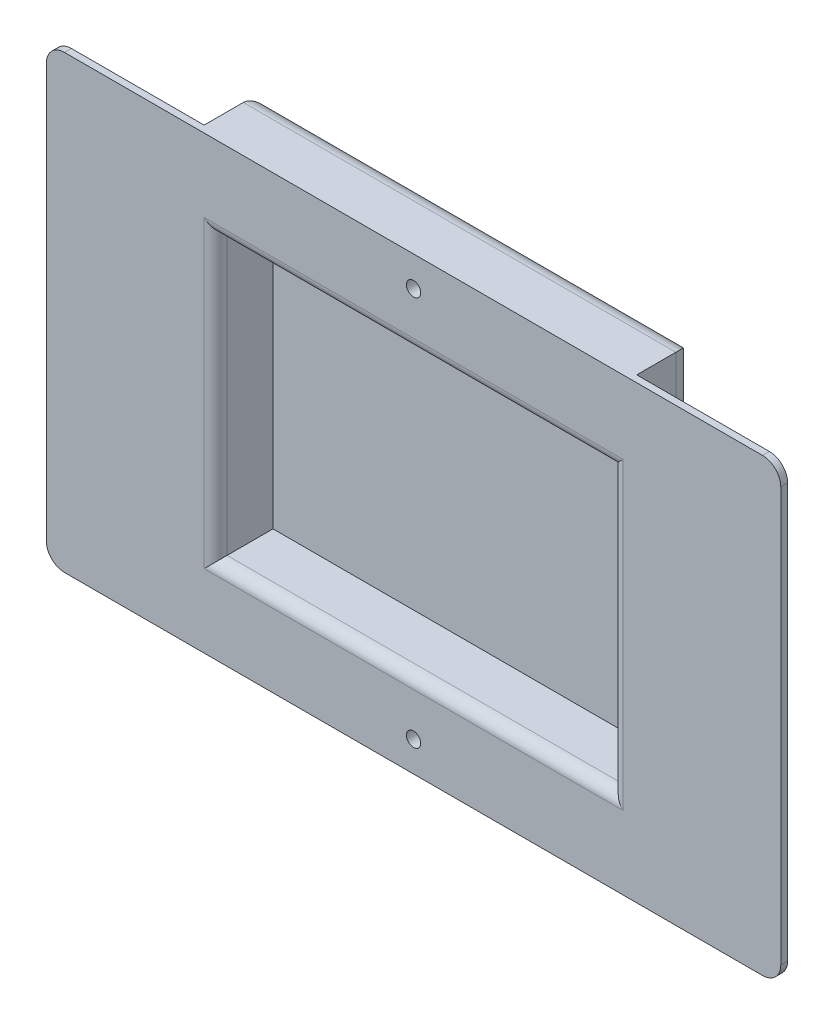
ISO-10303-21;
HEADER;
FILE_DESCRIPTION(('STEP AP214'),'2;1');
FILE_NAME('part.step','',(''),(''),'','','');
FILE_SCHEMA(('AUTOMOTIVE_DESIGN { 1 0 10303 214 1 1 1 1 }'));
ENDSEC;
DATA;
#1=APPLICATION_CONTEXT('core data for automotive mechanical design processes');
#2=APPLICATION_PROTOCOL_DEFINITION('international standard','automotive_design',2000,#1);
#3=PRODUCT_CONTEXT('',#1,'mechanical');
#4=PRODUCT('Part','Part','',(#3));
#5=PRODUCT_RELATED_PRODUCT_CATEGORY('part','',(#4));
#6=PRODUCT_DEFINITION_FORMATION('','',#4);
#7=PRODUCT_DEFINITION_CONTEXT('part definition',#1,'design');
#8=PRODUCT_DEFINITION('design','',#6,#7);
#9=PRODUCT_DEFINITION_SHAPE('','',#8);
#10=(LENGTH_UNIT() NAMED_UNIT(*) SI_UNIT(.MILLI.,.METRE.));
#11=(NAMED_UNIT(*) PLANE_ANGLE_UNIT() SI_UNIT($,.RADIAN.));
#12=(NAMED_UNIT(*) SI_UNIT($,.STERADIAN.) SOLID_ANGLE_UNIT());
#13=UNCERTAINTY_MEASURE_WITH_UNIT(LENGTH_MEASURE(1.E-05),#10,'distance_accuracy_value','');
#14=(GEOMETRIC_REPRESENTATION_CONTEXT(3) GLOBAL_UNCERTAINTY_ASSIGNED_CONTEXT((#13)) GLOBAL_UNIT_ASSIGNED_CONTEXT((#10,
#11,#12)) REPRESENTATION_CONTEXT('',''));
#15=CARTESIAN_POINT('',(0.,0.,0.));
#16=DIRECTION('',(0.,0.,1.));
#17=DIRECTION('',(1.,0.,0.));
#18=AXIS2_PLACEMENT_3D('',#15,#16,#17);
#19=CARTESIAN_POINT('',(64.,-39.25,11.2));
#20=DIRECTION('',(-1.,0.,0.));
#21=DIRECTION('',(0.,0.,1.));
#22=AXIS2_PLACEMENT_3D('',#19,#20,#21);
#23=PLANE('',#22);
#24=DIRECTION('',(0.,-1.,0.));
#25=VECTOR('',#24,1.);
#26=CARTESIAN_POINT('',(64.,39.251,10.));
#27=LINE('',#26,#25);
#28=CARTESIAN_POINT('',(64.,36.075,10.));
#29=VERTEX_POINT('',#28);
#30=CARTESIAN_POINT('',(64.,-36.075,10.));
#31=VERTEX_POINT('',#30);
#32=EDGE_CURVE('E187',#29,#31,#27,.T.);
#33=ORIENTED_EDGE('',*,*,#32,.F.);
#34=DIRECTION('',(0.,0.,-1.));
#35=VECTOR('',#34,1.);
#36=CARTESIAN_POINT('',(64.,36.075,11.2));
#37=LINE('',#36,#35);
#38=CARTESIAN_POINT('',(64.,36.075,11.2));
#39=VERTEX_POINT('',#38);
#40=EDGE_CURVE('E11',#29,#39,#37,.F.);
#41=ORIENTED_EDGE('',*,*,#40,.T.);
#42=DIRECTION('',(0.,1.,0.));
#43=VECTOR('',#42,1.);
#44=CARTESIAN_POINT('',(64.,-39.25,11.2));
#45=LINE('',#44,#43);
#46=CARTESIAN_POINT('',(64.,-36.075,11.2));
#47=VERTEX_POINT('',#46);
#48=EDGE_CURVE('E272',#47,#39,#45,.T.);
#49=ORIENTED_EDGE('',*,*,#48,.F.);
#50=DIRECTION('',(0.,0.,-1.));
#51=VECTOR('',#50,1.);
#52=CARTESIAN_POINT('',(64.,-36.075,11.2));
#53=LINE('',#52,#51);
#54=EDGE_CURVE('E49',#47,#31,#53,.T.);
#55=ORIENTED_EDGE('',*,*,#54,.T.);
#56=EDGE_LOOP('',(#33,#41,#49,#55));
#57=FACE_BOUND('',#56,.T.);
#58=ADVANCED_FACE('F39',(#57),#23,.F.);
#59=CARTESIAN_POINT('',(-64.,39.25,11.2));
#60=DIRECTION('',(0.,-1.,0.));
#61=DIRECTION('',(0.,0.,-1.));
#62=AXIS2_PLACEMENT_3D('',#59,#60,#61);
#63=PLANE('',#62);
#64=DIRECTION('',(0.,0.,1.));
#65=VECTOR('',#64,1.);
#66=CARTESIAN_POINT('',(37.7,39.25,10.));
#67=LINE('',#66,#65);
#68=CARTESIAN_POINT('',(37.7,39.25,3.175));
#69=VERTEX_POINT('',#68);
#70=CARTESIAN_POINT('',(37.7,39.25,10.));
#71=VERTEX_POINT('',#70);
#72=EDGE_CURVE('E195',#69,#71,#67,.T.);
#73=ORIENTED_EDGE('',*,*,#72,.F.);
#74=DIRECTION('',(-1.,0.,0.));
#75=VECTOR('',#74,1.);
#76=CARTESIAN_POINT('',(-37.6999999999999,39.25,3.175));
#77=LINE('',#76,#75);
#78=CARTESIAN_POINT('',(-37.7,39.25,3.17499999999998));
#79=VERTEX_POINT('',#78);
#80=EDGE_CURVE('E344',#69,#79,#77,.T.);
#81=ORIENTED_EDGE('',*,*,#80,.T.);
#82=DIRECTION('',(0.,0.,-1.));
#83=VECTOR('',#82,1.);
#84=CARTESIAN_POINT('',(-37.7,39.25,9.99999999999999));
#85=LINE('',#84,#83);
#86=CARTESIAN_POINT('',(-37.7,39.25,9.99999999999999));
#87=VERTEX_POINT('',#86);
#88=EDGE_CURVE('E212',#87,#79,#85,.T.);
#89=ORIENTED_EDGE('',*,*,#88,.F.);
#90=DIRECTION('',(1.,0.,0.));
#91=VECTOR('',#90,1.);
#92=CARTESIAN_POINT('',(-37.7,39.25,9.99999999999999));
#93=LINE('',#92,#91);
#94=CARTESIAN_POINT('',(-60.825,39.25,9.99999999999998));
#95=VERTEX_POINT('',#94);
#96=EDGE_CURVE('E228',#95,#87,#93,.T.);
#97=ORIENTED_EDGE('',*,*,#96,.F.);
#98=DIRECTION('',(0.,0.,-1.));
#99=VECTOR('',#98,1.);
#100=CARTESIAN_POINT('',(-60.825,39.25,11.2));
#101=LINE('',#100,#99);
#102=CARTESIAN_POINT('',(-60.825,39.25,11.2));
#103=VERTEX_POINT('',#102);
#104=EDGE_CURVE('E341',#95,#103,#101,.F.);
#105=ORIENTED_EDGE('',*,*,#104,.T.);
#106=DIRECTION('',(-1.,0.,0.));
#107=VECTOR('',#106,1.);
#108=CARTESIAN_POINT('',(-64.,39.25,11.2));
#109=LINE('',#108,#107);
#110=CARTESIAN_POINT('',(60.825,39.25,11.2));
#111=VERTEX_POINT('',#110);
#112=EDGE_CURVE('E287',#111,#103,#109,.T.);
#113=ORIENTED_EDGE('',*,*,#112,.F.);
#114=DIRECTION('',(0.,0.,-1.));
#115=VECTOR('',#114,1.);
#116=CARTESIAN_POINT('',(60.825,39.25,11.2));
#117=LINE('',#116,#115);
#118=CARTESIAN_POINT('',(60.825,39.25,10.));
#119=VERTEX_POINT('',#118);
#120=EDGE_CURVE('E325',#111,#119,#117,.T.);
#121=ORIENTED_EDGE('',*,*,#120,.T.);
#122=DIRECTION('',(1.,0.,0.));
#123=VECTOR('',#122,1.);
#124=CARTESIAN_POINT('',(37.7,39.25,10.));
#125=LINE('',#124,#123);
#126=EDGE_CURVE('E206',#71,#119,#125,.T.);
#127=ORIENTED_EDGE('',*,*,#126,.F.);
#128=EDGE_LOOP('',(#73,#81,#89,#97,#105,#113,#121,#127));
#129=FACE_BOUND('',#128,.T.);
#130=ADVANCED_FACE('F440',(#129),#63,.F.);
#131=CARTESIAN_POINT('',(-64.,-39.25,11.2));
#132=DIRECTION('',(1.,0.,0.));
#133=DIRECTION('',(0.,0.,-1.));
#134=AXIS2_PLACEMENT_3D('',#131,#132,#133);
#135=PLANE('',#134);
#136=DIRECTION('',(0.,-1.,0.));
#137=VECTOR('',#136,1.);
#138=CARTESIAN_POINT('',(-64.,39.251,9.99999999999998));
#139=LINE('',#138,#137);
#140=CARTESIAN_POINT('',(-64.,36.075,9.99999999999998));
#141=VERTEX_POINT('',#140);
#142=CARTESIAN_POINT('',(-64.,-36.075,9.99999999999998));
#143=VERTEX_POINT('',#142);
#144=EDGE_CURVE('E224',#141,#143,#139,.T.);
#145=ORIENTED_EDGE('',*,*,#144,.T.);
#146=DIRECTION('',(0.,0.,-1.));
#147=VECTOR('',#146,1.);
#148=CARTESIAN_POINT('',(-64.,-36.075,11.2));
#149=LINE('',#148,#147);
#150=CARTESIAN_POINT('',(-64.,-36.075,11.2));
#151=VERTEX_POINT('',#150);
#152=EDGE_CURVE('E386',#143,#151,#149,.F.);
#153=ORIENTED_EDGE('',*,*,#152,.T.);
#154=DIRECTION('',(0.,-1.,0.));
#155=VECTOR('',#154,1.);
#156=CARTESIAN_POINT('',(-64.,-39.25,11.2));
#157=LINE('',#156,#155);
#158=CARTESIAN_POINT('',(-64.,36.075,11.2));
#159=VERTEX_POINT('',#158);
#160=EDGE_CURVE('E291',#159,#151,#157,.T.);
#161=ORIENTED_EDGE('',*,*,#160,.F.);
#162=DIRECTION('',(0.,0.,-1.));
#163=VECTOR('',#162,1.);
#164=CARTESIAN_POINT('',(-64.,36.075,11.2));
#165=LINE('',#164,#163);
#166=EDGE_CURVE('E382',#159,#141,#165,.T.);
#167=ORIENTED_EDGE('',*,*,#166,.T.);
#168=EDGE_LOOP('',(#145,#153,#161,#167));
#169=FACE_BOUND('',#168,.T.);
#170=ADVANCED_FACE('F455',(#169),#135,.F.);
#171=CARTESIAN_POINT('',(-64.,-39.25,11.2));
#172=DIRECTION('',(0.,1.,0.));
#173=DIRECTION('',(0.,0.,1.));
#174=AXIS2_PLACEMENT_3D('',#171,#172,#173);
#175=PLANE('',#174);
#176=DIRECTION('',(0.,0.,1.));
#177=VECTOR('',#176,1.);
#178=CARTESIAN_POINT('',(-37.7,-39.25,9.99999999999999));
#179=LINE('',#178,#177);
#180=CARTESIAN_POINT('',(-37.7,-39.25,3.17499999999998));
#181=VERTEX_POINT('',#180);
#182=CARTESIAN_POINT('',(-37.7,-39.25,9.99999999999999));
#183=VERTEX_POINT('',#182);
#184=EDGE_CURVE('E216',#181,#183,#179,.T.);
#185=ORIENTED_EDGE('',*,*,#184,.F.);
#186=DIRECTION('',(1.,0.,0.));
#187=VECTOR('',#186,1.);
#188=CARTESIAN_POINT('',(37.7,-39.25,3.175));
#189=LINE('',#188,#187);
#190=CARTESIAN_POINT('',(37.7,-39.25,3.175));
#191=VERTEX_POINT('',#190);
#192=EDGE_CURVE('E202',#181,#191,#189,.T.);
#193=ORIENTED_EDGE('',*,*,#192,.T.);
#194=DIRECTION('',(0.,0.,-1.));
#195=VECTOR('',#194,1.);
#196=CARTESIAN_POINT('',(37.7,-39.25,10.));
#197=LINE('',#196,#195);
#198=CARTESIAN_POINT('',(37.7,-39.25,10.));
#199=VERTEX_POINT('',#198);
#200=EDGE_CURVE('E188',#199,#191,#197,.T.);
#201=ORIENTED_EDGE('',*,*,#200,.F.);
#202=DIRECTION('',(-1.,0.,0.));
#203=VECTOR('',#202,1.);
#204=CARTESIAN_POINT('',(37.7,-39.25,10.));
#205=LINE('',#204,#203);
#206=CARTESIAN_POINT('',(60.825,-39.25,10.));
#207=VERTEX_POINT('',#206);
#208=EDGE_CURVE('E179',#207,#199,#205,.T.);
#209=ORIENTED_EDGE('',*,*,#208,.F.);
#210=DIRECTION('',(0.,0.,-1.));
#211=VECTOR('',#210,1.);
#212=CARTESIAN_POINT('',(60.825,-39.25,11.2));
#213=LINE('',#212,#211);
#214=CARTESIAN_POINT('',(60.825,-39.25,11.2));
#215=VERTEX_POINT('',#214);
#216=EDGE_CURVE('E364',#207,#215,#213,.F.);
#217=ORIENTED_EDGE('',*,*,#216,.T.);
#218=DIRECTION('',(1.,0.,0.));
#219=VECTOR('',#218,1.);
#220=CARTESIAN_POINT('',(-64.,-39.25,11.2));
#221=LINE('',#220,#219);
#222=CARTESIAN_POINT('',(-60.825,-39.25,11.2));
#223=VERTEX_POINT('',#222);
#224=EDGE_CURVE('E295',#223,#215,#221,.T.);
#225=ORIENTED_EDGE('',*,*,#224,.F.);
#226=DIRECTION('',(0.,0.,-1.));
#227=VECTOR('',#226,1.);
#228=CARTESIAN_POINT('',(-60.825,-39.25,11.2));
#229=LINE('',#228,#227);
#230=CARTESIAN_POINT('',(-60.825,-39.25,9.99999999999998));
#231=VERTEX_POINT('',#230);
#232=EDGE_CURVE('E367',#223,#231,#229,.T.);
#233=ORIENTED_EDGE('',*,*,#232,.T.);
#234=DIRECTION('',(-1.,0.,0.));
#235=VECTOR('',#234,1.);
#236=CARTESIAN_POINT('',(-37.7,-39.25,9.99999999999999));
#237=LINE('',#236,#235);
#238=EDGE_CURVE('E219',#183,#231,#237,.T.);
#239=ORIENTED_EDGE('',*,*,#238,.F.);
#240=EDGE_LOOP('',(#185,#193,#201,#209,#217,#225,#233,#239));
#241=FACE_BOUND('',#240,.T.);
#242=ADVANCED_FACE('F200',(#241),#175,.F.);
#243=CARTESIAN_POINT('',(0.,0.,11.2));
#244=DIRECTION('',(0.,0.,-1.));
#245=DIRECTION('',(-1.,0.,0.));
#246=AXIS2_PLACEMENT_3D('',#243,#244,#245);
#247=PLANE('',#246);
#248=CARTESIAN_POINT('',(0.,34.,11.2));
#249=DIRECTION('',(0.,0.,1.));
#250=DIRECTION('',(1.,0.,0.));
#251=AXIS2_PLACEMENT_3D('',#248,#249,#250);
#252=CIRCLE('',#251,1.2446);
#253=CARTESIAN_POINT('',(1.2446,34.,11.2));
#254=VERTEX_POINT('',#253);
#255=EDGE_CURVE('E239',#254,#254,#252,.T.);
#256=ORIENTED_EDGE('',*,*,#255,.F.);
#257=EDGE_LOOP('',(#256));
#258=FACE_BOUND('',#257,.T.);
#259=CARTESIAN_POINT('',(0.,-34.,11.2));
#260=DIRECTION('',(0.,0.,1.));
#261=DIRECTION('',(-1.,0.,0.));
#262=AXIS2_PLACEMENT_3D('',#259,#260,#261);
#263=CIRCLE('',#262,1.2446);
#264=CARTESIAN_POINT('',(-1.2446,-34.,11.2));
#265=VERTEX_POINT('',#264);
#266=EDGE_CURVE('E197',#265,#265,#263,.T.);
#267=ORIENTED_EDGE('',*,*,#266,.F.);
#268=EDGE_LOOP('',(#267));
#269=FACE_BOUND('',#268,.T.);
#270=DIRECTION('',(1.,0.,0.));
#271=VECTOR('',#270,1.);
#272=CARTESIAN_POINT('',(0.,-26.5,11.2));
#273=LINE('',#272,#271);
#274=CARTESIAN_POINT('',(36.5,-26.5,11.2));
#275=VERTEX_POINT('',#274);
#276=CARTESIAN_POINT('',(-36.5,-26.5,11.2));
#277=VERTEX_POINT('',#276);
#278=EDGE_CURVE('E309',#275,#277,#273,.F.);
#279=ORIENTED_EDGE('',*,*,#278,.T.);
#280=DIRECTION('',(0.,-1.,0.));
#281=VECTOR('',#280,1.);
#282=CARTESIAN_POINT('',(-36.5,0.,11.2));
#283=LINE('',#282,#281);
#284=CARTESIAN_POINT('',(-36.5,26.5,11.2));
#285=VERTEX_POINT('',#284);
#286=EDGE_CURVE('E312',#277,#285,#283,.F.);
#287=ORIENTED_EDGE('',*,*,#286,.T.);
#288=DIRECTION('',(-1.,0.,0.));
#289=VECTOR('',#288,1.);
#290=CARTESIAN_POINT('',(0.,26.5,11.2));
#291=LINE('',#290,#289);
#292=CARTESIAN_POINT('',(36.5,26.5,11.2));
#293=VERTEX_POINT('',#292);
#294=EDGE_CURVE('E303',#285,#293,#291,.F.);
#295=ORIENTED_EDGE('',*,*,#294,.T.);
#296=DIRECTION('',(0.,1.,0.));
#297=VECTOR('',#296,1.);
#298=CARTESIAN_POINT('',(36.5,0.,11.2));
#299=LINE('',#298,#297);
#300=EDGE_CURVE('E306',#293,#275,#299,.F.);
#301=ORIENTED_EDGE('',*,*,#300,.T.);
#302=EDGE_LOOP('',(#279,#287,#295,#301));
#303=FACE_BOUND('',#302,.T.);
#304=ORIENTED_EDGE('',*,*,#160,.T.);
#305=CARTESIAN_POINT('',(-60.825,-36.075,11.2));
#306=DIRECTION('',(0.,0.,-1.));
#307=DIRECTION('',(-1.,0.,0.));
#308=AXIS2_PLACEMENT_3D('',#305,#306,#307);
#309=CIRCLE('',#308,3.175);
#310=EDGE_CURVE('E398',#151,#223,#309,.F.);
#311=ORIENTED_EDGE('',*,*,#310,.T.);
#312=ORIENTED_EDGE('',*,*,#224,.T.);
#313=CARTESIAN_POINT('',(60.825,-36.075,11.2));
#314=DIRECTION('',(0.,0.,-1.));
#315=DIRECTION('',(-1.,0.,0.));
#316=AXIS2_PLACEMENT_3D('',#313,#314,#315);
#317=CIRCLE('',#316,3.175);
#318=EDGE_CURVE('E389',#215,#47,#317,.F.);
#319=ORIENTED_EDGE('',*,*,#318,.T.);
#320=ORIENTED_EDGE('',*,*,#48,.T.);
#321=CARTESIAN_POINT('',(60.825,36.075,11.2));
#322=DIRECTION('',(0.,0.,-1.));
#323=DIRECTION('',(-1.,0.,0.));
#324=AXIS2_PLACEMENT_3D('',#321,#322,#323);
#325=CIRCLE('',#324,3.175);
#326=EDGE_CURVE('E392',#39,#111,#325,.F.);
#327=ORIENTED_EDGE('',*,*,#326,.T.);
#328=ORIENTED_EDGE('',*,*,#112,.T.);
#329=CARTESIAN_POINT('',(-60.825,36.075,11.2));
#330=DIRECTION('',(0.,0.,-1.));
#331=DIRECTION('',(-1.,0.,0.));
#332=AXIS2_PLACEMENT_3D('',#329,#330,#331);
#333=CIRCLE('',#332,3.175);
#334=EDGE_CURVE('E395',#103,#159,#333,.F.);
#335=ORIENTED_EDGE('',*,*,#334,.T.);
#336=EDGE_LOOP('',(#304,#311,#312,#319,#320,#327,#328,#335));
#337=FACE_BOUND('',#336,.T.);
#338=ADVANCED_FACE('F465',(#258,#269,#303,#337),#247,.F.);
#339=CARTESIAN_POINT('',(0.,0.,0.));
#340=DIRECTION('',(0.,0.,-1.));
#341=DIRECTION('',(-1.,0.,0.));
#342=AXIS2_PLACEMENT_3D('',#339,#340,#341);
#343=PLANE('',#342);
#344=DIRECTION('',(0.,-1.,0.));
#345=VECTOR('',#344,1.);
#346=CARTESIAN_POINT('',(-34.525,39.25,0.));
#347=LINE('',#346,#345);
#348=CARTESIAN_POINT('',(-34.525,-36.075,0.));
#349=VERTEX_POINT('',#348);
#350=CARTESIAN_POINT('',(-34.525,36.075,0.));
#351=VERTEX_POINT('',#350);
#352=EDGE_CURVE('E348',#349,#351,#347,.F.);
#353=ORIENTED_EDGE('',*,*,#352,.T.);
#354=DIRECTION('',(-1.,0.,0.));
#355=VECTOR('',#354,1.);
#356=CARTESIAN_POINT('',(37.7,36.075,0.));
#357=LINE('',#356,#355);
#358=CARTESIAN_POINT('',(34.525,36.075,0.));
#359=VERTEX_POINT('',#358);
#360=EDGE_CURVE('E357',#351,#359,#357,.F.);
#361=ORIENTED_EDGE('',*,*,#360,.T.);
#362=DIRECTION('',(0.,-1.,0.));
#363=VECTOR('',#362,1.);
#364=CARTESIAN_POINT('',(34.525,-39.25,0.));
#365=LINE('',#364,#363);
#366=CARTESIAN_POINT('',(34.525,-36.075,0.));
#367=VERTEX_POINT('',#366);
#368=EDGE_CURVE('E354',#359,#367,#365,.T.);
#369=ORIENTED_EDGE('',*,*,#368,.T.);
#370=DIRECTION('',(1.,0.,0.));
#371=VECTOR('',#370,1.);
#372=CARTESIAN_POINT('',(-37.6999999999999,-36.075,0.));
#373=LINE('',#372,#371);
#374=EDGE_CURVE('E351',#367,#349,#373,.F.);
#375=ORIENTED_EDGE('',*,*,#374,.T.);
#376=EDGE_LOOP('',(#353,#361,#369,#375));
#377=FACE_BOUND('',#376,.T.);
#378=ADVANCED_FACE('F430',(#377),#343,.T.);
#379=CARTESIAN_POINT('',(34.5,24.5,1.2));
#380=DIRECTION('',(1.,0.,0.));
#381=DIRECTION('',(0.,0.,-1.));
#382=AXIS2_PLACEMENT_3D('',#379,#380,#381);
#383=PLANE('',#382);
#384=DIRECTION('',(0.,0.,1.));
#385=VECTOR('',#384,1.);
#386=CARTESIAN_POINT('',(34.5,-24.5,1.2));
#387=LINE('',#386,#385);
#388=CARTESIAN_POINT('',(34.5,-24.5,1.2));
#389=VERTEX_POINT('',#388);
#390=CARTESIAN_POINT('',(34.5,-24.5,9.2));
#391=VERTEX_POINT('',#390);
#392=EDGE_CURVE('E268',#389,#391,#387,.T.);
#393=ORIENTED_EDGE('',*,*,#392,.T.);
#394=DIRECTION('',(0.,1.,0.));
#395=VECTOR('',#394,1.);
#396=CARTESIAN_POINT('',(34.5,24.5,9.2));
#397=LINE('',#396,#395);
#398=CARTESIAN_POINT('',(34.5,24.5,9.2));
#399=VERTEX_POINT('',#398);
#400=EDGE_CURVE('E319',#391,#399,#397,.T.);
#401=ORIENTED_EDGE('',*,*,#400,.T.);
#402=DIRECTION('',(0.,0.,1.));
#403=VECTOR('',#402,1.);
#404=CARTESIAN_POINT('',(34.5,24.5,1.2));
#405=LINE('',#404,#403);
#406=CARTESIAN_POINT('',(34.5,24.5,1.2));
#407=VERTEX_POINT('',#406);
#408=EDGE_CURVE('E267',#407,#399,#405,.T.);
#409=ORIENTED_EDGE('',*,*,#408,.F.);
#410=DIRECTION('',(0.,1.,0.));
#411=VECTOR('',#410,1.);
#412=CARTESIAN_POINT('',(34.5,24.5,1.2));
#413=LINE('',#412,#411);
#414=EDGE_CURVE('E250',#389,#407,#413,.T.);
#415=ORIENTED_EDGE('',*,*,#414,.F.);
#416=EDGE_LOOP('',(#393,#401,#409,#415));
#417=FACE_BOUND('',#416,.T.);
#418=ADVANCED_FACE('F675',(#417),#383,.F.);
#419=CARTESIAN_POINT('',(-34.5,-24.5,1.2));
#420=DIRECTION('',(0.,-1.,0.));
#421=DIRECTION('',(0.,0.,-1.));
#422=AXIS2_PLACEMENT_3D('',#419,#420,#421);
#423=PLANE('',#422);
#424=DIRECTION('',(0.,0.,1.));
#425=VECTOR('',#424,1.);
#426=CARTESIAN_POINT('',(-34.5,-24.5,1.2));
#427=LINE('',#426,#425);
#428=CARTESIAN_POINT('',(-34.5,-24.5,1.2));
#429=VERTEX_POINT('',#428);
#430=CARTESIAN_POINT('',(-34.5,-24.5,9.2));
#431=VERTEX_POINT('',#430);
#432=EDGE_CURVE('E273',#429,#431,#427,.T.);
#433=ORIENTED_EDGE('',*,*,#432,.T.);
#434=DIRECTION('',(1.,0.,0.));
#435=VECTOR('',#434,1.);
#436=CARTESIAN_POINT('',(-34.5,-24.5,9.2));
#437=LINE('',#436,#435);
#438=EDGE_CURVE('E316',#431,#391,#437,.T.);
#439=ORIENTED_EDGE('',*,*,#438,.T.);
#440=ORIENTED_EDGE('',*,*,#392,.F.);
#441=DIRECTION('',(1.,0.,0.));
#442=VECTOR('',#441,1.);
#443=CARTESIAN_POINT('',(-34.5,-24.5,1.2));
#444=LINE('',#443,#442);
#445=EDGE_CURVE('E263',#429,#389,#444,.T.);
#446=ORIENTED_EDGE('',*,*,#445,.F.);
#447=EDGE_LOOP('',(#433,#439,#440,#446));
#448=FACE_BOUND('',#447,.T.);
#449=ADVANCED_FACE('F666',(#448),#423,.F.);
#450=CARTESIAN_POINT('',(-34.5,24.5,1.2));
#451=DIRECTION('',(-1.,0.,0.));
#452=DIRECTION('',(0.,-1.,0.));
#453=AXIS2_PLACEMENT_3D('',#450,#451,#452);
#454=PLANE('',#453);
#455=DIRECTION('',(0.,0.,1.));
#456=VECTOR('',#455,1.);
#457=CARTESIAN_POINT('',(-34.5,24.5,1.2));
#458=LINE('',#457,#456);
#459=CARTESIAN_POINT('',(-34.5,24.5,1.2));
#460=VERTEX_POINT('',#459);
#461=CARTESIAN_POINT('',(-34.5,24.5,9.2));
#462=VERTEX_POINT('',#461);
#463=EDGE_CURVE('E277',#460,#462,#458,.T.);
#464=ORIENTED_EDGE('',*,*,#463,.T.);
#465=DIRECTION('',(0.,-1.,0.));
#466=VECTOR('',#465,1.);
#467=CARTESIAN_POINT('',(-34.5,24.5,9.2));
#468=LINE('',#467,#466);
#469=EDGE_CURVE('E299',#462,#431,#468,.T.);
#470=ORIENTED_EDGE('',*,*,#469,.T.);
#471=ORIENTED_EDGE('',*,*,#432,.F.);
#472=DIRECTION('',(0.,-1.,0.));
#473=VECTOR('',#472,1.);
#474=CARTESIAN_POINT('',(-34.5,24.5,1.2));
#475=LINE('',#474,#473);
#476=EDGE_CURVE('E259',#460,#429,#475,.T.);
#477=ORIENTED_EDGE('',*,*,#476,.F.);
#478=EDGE_LOOP('',(#464,#470,#471,#477));
#479=FACE_BOUND('',#478,.T.);
#480=ADVANCED_FACE('F657',(#479),#454,.F.);
#481=CARTESIAN_POINT('',(-34.5,24.5,1.2));
#482=DIRECTION('',(0.,1.,0.));
#483=DIRECTION('',(0.,0.,1.));
#484=AXIS2_PLACEMENT_3D('',#481,#482,#483);
#485=PLANE('',#484);
#486=ORIENTED_EDGE('',*,*,#408,.T.);
#487=DIRECTION('',(-1.,0.,0.));
#488=VECTOR('',#487,1.);
#489=CARTESIAN_POINT('',(-34.5,24.5,9.2));
#490=LINE('',#489,#488);
#491=EDGE_CURVE('E322',#399,#462,#490,.T.);
#492=ORIENTED_EDGE('',*,*,#491,.T.);
#493=ORIENTED_EDGE('',*,*,#463,.F.);
#494=DIRECTION('',(-1.,0.,0.));
#495=VECTOR('',#494,1.);
#496=CARTESIAN_POINT('',(-34.5,24.5,1.2));
#497=LINE('',#496,#495);
#498=EDGE_CURVE('E254',#407,#460,#497,.T.);
#499=ORIENTED_EDGE('',*,*,#498,.F.);
#500=EDGE_LOOP('',(#486,#492,#493,#499));
#501=FACE_BOUND('',#500,.T.);
#502=ADVANCED_FACE('F648',(#501),#485,.F.);
#503=CARTESIAN_POINT('',(0.,0.,1.2));
#504=DIRECTION('',(0.,0.,1.));
#505=DIRECTION('',(1.,0.,0.));
#506=AXIS2_PLACEMENT_3D('',#503,#504,#505);
#507=PLANE('',#506);
#508=ORIENTED_EDGE('',*,*,#414,.T.);
#509=ORIENTED_EDGE('',*,*,#498,.T.);
#510=ORIENTED_EDGE('',*,*,#476,.T.);
#511=ORIENTED_EDGE('',*,*,#445,.T.);
#512=EDGE_LOOP('',(#508,#509,#510,#511));
#513=FACE_BOUND('',#512,.T.);
#514=ADVANCED_FACE('F502',(#513),#507,.T.);
#515=CARTESIAN_POINT('',(36.5,24.5,9.2));
#516=DIRECTION('',(0.,1.,0.));
#517=DIRECTION('',(0.,0.,1.));
#518=AXIS2_PLACEMENT_3D('',#515,#516,#517);
#519=CYLINDRICAL_SURFACE('',#518,2.);
#520=CARTESIAN_POINT('',(36.5,-26.5,9.2));
#521=DIRECTION('',(0.707106781186547,0.707106781186547,0.));
#522=DIRECTION('',(0.707106781186547,-0.707106781186547,0.));
#523=AXIS2_PLACEMENT_3D('',#520,#521,#522);
#524=ELLIPSE('',#523,2.82842712474619,2.);
#525=EDGE_CURVE('E331',#275,#391,#524,.F.);
#526=ORIENTED_EDGE('',*,*,#525,.F.);
#527=ORIENTED_EDGE('',*,*,#300,.F.);
#528=CARTESIAN_POINT('',(36.5,26.5,9.2));
#529=DIRECTION('',(-0.707106781186547,0.707106781186547,0.));
#530=DIRECTION('',(0.707106781186547,0.707106781186547,0.));
#531=AXIS2_PLACEMENT_3D('',#528,#529,#530);
#532=ELLIPSE('',#531,2.82842712474619,2.);
#533=EDGE_CURVE('E255',#399,#293,#532,.T.);
#534=ORIENTED_EDGE('',*,*,#533,.F.);
#535=ORIENTED_EDGE('',*,*,#400,.F.);
#536=EDGE_LOOP('',(#526,#527,#534,#535));
#537=FACE_BOUND('',#536,.T.);
#538=ADVANCED_FACE('F498',(#537),#519,.T.);
#539=CARTESIAN_POINT('',(-34.5,26.5,9.2));
#540=DIRECTION('',(-1.,0.,0.));
#541=DIRECTION('',(0.,0.,1.));
#542=AXIS2_PLACEMENT_3D('',#539,#540,#541);
#543=CYLINDRICAL_SURFACE('',#542,2.);
#544=ORIENTED_EDGE('',*,*,#533,.T.);
#545=ORIENTED_EDGE('',*,*,#294,.F.);
#546=CARTESIAN_POINT('',(-36.5,26.5,9.2));
#547=DIRECTION('',(-0.707106781186547,-0.707106781186548,0.));
#548=DIRECTION('',(0.707106781186548,-0.707106781186547,0.));
#549=AXIS2_PLACEMENT_3D('',#546,#547,#548);
#550=ELLIPSE('',#549,2.82842712474619,2.);
#551=EDGE_CURVE('E328',#462,#285,#550,.T.);
#552=ORIENTED_EDGE('',*,*,#551,.F.);
#553=ORIENTED_EDGE('',*,*,#491,.F.);
#554=EDGE_LOOP('',(#544,#545,#552,#553));
#555=FACE_BOUND('',#554,.T.);
#556=ADVANCED_FACE('F494',(#555),#543,.T.);
#557=CARTESIAN_POINT('',(-34.5,-26.5,9.2));
#558=DIRECTION('',(1.,0.,0.));
#559=DIRECTION('',(0.,0.,-1.));
#560=AXIS2_PLACEMENT_3D('',#557,#558,#559);
#561=CYLINDRICAL_SURFACE('',#560,2.);
#562=ORIENTED_EDGE('',*,*,#525,.T.);
#563=ORIENTED_EDGE('',*,*,#438,.F.);
#564=CARTESIAN_POINT('',(-36.5,-26.5,9.2));
#565=DIRECTION('',(0.707106781186548,-0.707106781186547,0.));
#566=DIRECTION('',(-0.707106781186547,-0.707106781186548,0.));
#567=AXIS2_PLACEMENT_3D('',#564,#565,#566);
#568=ELLIPSE('',#567,2.82842712474619,2.);
#569=EDGE_CURVE('E238',#277,#431,#568,.F.);
#570=ORIENTED_EDGE('',*,*,#569,.F.);
#571=ORIENTED_EDGE('',*,*,#278,.F.);
#572=EDGE_LOOP('',(#562,#563,#570,#571));
#573=FACE_BOUND('',#572,.T.);
#574=ADVANCED_FACE('F490',(#573),#561,.T.);
#575=CARTESIAN_POINT('',(-36.5,24.5,9.2));
#576=DIRECTION('',(0.,-1.,0.));
#577=DIRECTION('',(1.,0.,0.));
#578=AXIS2_PLACEMENT_3D('',#575,#576,#577);
#579=CYLINDRICAL_SURFACE('',#578,2.);
#580=ORIENTED_EDGE('',*,*,#551,.T.);
#581=ORIENTED_EDGE('',*,*,#286,.F.);
#582=ORIENTED_EDGE('',*,*,#569,.T.);
#583=ORIENTED_EDGE('',*,*,#469,.F.);
#584=EDGE_LOOP('',(#580,#581,#582,#583));
#585=FACE_BOUND('',#584,.T.);
#586=ADVANCED_FACE('F486',(#585),#579,.T.);
#587=CARTESIAN_POINT('',(0.,-34.,1.2));
#588=DIRECTION('',(0.,0.,1.));
#589=DIRECTION('',(1.,0.,0.));
#590=AXIS2_PLACEMENT_3D('',#587,#588,#589);
#591=CYLINDRICAL_SURFACE('',#590,1.2446);
#592=CARTESIAN_POINT('',(0.,-34.,1.2));
#593=DIRECTION('',(0.,0.,1.));
#594=DIRECTION('',(-1.,0.,0.));
#595=AXIS2_PLACEMENT_3D('',#592,#593,#594);
#596=CIRCLE('',#595,1.2446);
#597=CARTESIAN_POINT('',(-1.2446,-34.,1.2));
#598=VERTEX_POINT('',#597);
#599=EDGE_CURVE('E243',#598,#598,#596,.T.);
#600=ORIENTED_EDGE('',*,*,#599,.F.);
#601=EDGE_LOOP('',(#600));
#602=FACE_BOUND('',#601,.T.);
#603=ORIENTED_EDGE('',*,*,#266,.T.);
#604=EDGE_LOOP('',(#603));
#605=FACE_BOUND('',#604,.T.);
#606=ADVANCED_FACE('F489',(#602,#605),#591,.F.);
#607=CARTESIAN_POINT('',(0.,-34.,1.2));
#608=DIRECTION('',(0.,0.,-1.));
#609=DIRECTION('',(-1.,0.,0.));
#610=AXIS2_PLACEMENT_3D('',#607,#608,#609);
#611=PLANE('',#610);
#612=ORIENTED_EDGE('',*,*,#599,.T.);
#613=EDGE_LOOP('',(#612));
#614=FACE_BOUND('',#613,.T.);
#615=ADVANCED_FACE('F602',(#614),#611,.F.);
#616=CARTESIAN_POINT('',(0.,34.,1.2));
#617=DIRECTION('',(0.,0.,1.));
#618=DIRECTION('',(1.,0.,0.));
#619=AXIS2_PLACEMENT_3D('',#616,#617,#618);
#620=CYLINDRICAL_SURFACE('',#619,1.2446);
#621=CARTESIAN_POINT('',(0.,34.,1.2));
#622=DIRECTION('',(0.,0.,1.));
#623=DIRECTION('',(1.,0.,0.));
#624=AXIS2_PLACEMENT_3D('',#621,#622,#623);
#625=CIRCLE('',#624,1.2446);
#626=CARTESIAN_POINT('',(1.2446,34.,1.2));
#627=VERTEX_POINT('',#626);
#628=EDGE_CURVE('E234',#627,#627,#625,.T.);
#629=ORIENTED_EDGE('',*,*,#628,.F.);
#630=EDGE_LOOP('',(#629));
#631=FACE_BOUND('',#630,.T.);
#632=ORIENTED_EDGE('',*,*,#255,.T.);
#633=EDGE_LOOP('',(#632));
#634=FACE_BOUND('',#633,.T.);
#635=ADVANCED_FACE('F593',(#631,#634),#620,.F.);
#636=CARTESIAN_POINT('',(0.,34.,1.2));
#637=DIRECTION('',(0.,0.,1.));
#638=DIRECTION('',(1.,0.,0.));
#639=AXIS2_PLACEMENT_3D('',#636,#637,#638);
#640=PLANE('',#639);
#641=ORIENTED_EDGE('',*,*,#628,.T.);
#642=EDGE_LOOP('',(#641));
#643=FACE_BOUND('',#642,.T.);
#644=ADVANCED_FACE('F584',(#643),#640,.T.);
#645=CARTESIAN_POINT('',(-37.7,39.251,9.99999999999999));
#646=DIRECTION('',(1.,0.,0.));
#647=DIRECTION('',(0.,0.,-1.));
#648=AXIS2_PLACEMENT_3D('',#645,#646,#647);
#649=PLANE('',#648);
#650=ORIENTED_EDGE('',*,*,#88,.T.);
#651=DIRECTION('',(0.,-1.,0.));
#652=VECTOR('',#651,1.);
#653=CARTESIAN_POINT('',(-37.7,-39.25,3.17499999999998));
#654=LINE('',#653,#652);
#655=EDGE_CURVE('E373',#79,#181,#654,.T.);
#656=ORIENTED_EDGE('',*,*,#655,.T.);
#657=ORIENTED_EDGE('',*,*,#184,.T.);
#658=DIRECTION('',(0.,-1.,0.));
#659=VECTOR('',#658,1.);
#660=CARTESIAN_POINT('',(-37.7,39.251,9.99999999999999));
#661=LINE('',#660,#659);
#662=EDGE_CURVE('E223',#87,#183,#661,.T.);
#663=ORIENTED_EDGE('',*,*,#662,.F.);
#664=EDGE_LOOP('',(#650,#656,#657,#663));
#665=FACE_BOUND('',#664,.T.);
#666=ADVANCED_FACE('F443',(#665),#649,.F.);
#667=CARTESIAN_POINT('',(-37.7,39.251,9.99999999999999));
#668=DIRECTION('',(0.,0.,1.));
#669=DIRECTION('',(1.,0.,0.));
#670=AXIS2_PLACEMENT_3D('',#667,#668,#669);
#671=PLANE('',#670);
#672=ORIENTED_EDGE('',*,*,#238,.T.);
#673=CARTESIAN_POINT('',(-60.825,-36.075,9.99999999999998));
#674=DIRECTION('',(0.,0.,1.));
#675=DIRECTION('',(1.,0.,0.));
#676=AXIS2_PLACEMENT_3D('',#673,#674,#675);
#677=CIRCLE('',#676,3.175);
#678=EDGE_CURVE('E379',#231,#143,#677,.F.);
#679=ORIENTED_EDGE('',*,*,#678,.T.);
#680=ORIENTED_EDGE('',*,*,#144,.F.);
#681=CARTESIAN_POINT('',(-60.825,36.075,9.99999999999998));
#682=DIRECTION('',(0.,0.,1.));
#683=DIRECTION('',(1.,0.,0.));
#684=AXIS2_PLACEMENT_3D('',#681,#682,#683);
#685=CIRCLE('',#684,3.175);
#686=EDGE_CURVE('E376',#141,#95,#685,.F.);
#687=ORIENTED_EDGE('',*,*,#686,.T.);
#688=ORIENTED_EDGE('',*,*,#96,.T.);
#689=ORIENTED_EDGE('',*,*,#662,.T.);
#690=EDGE_LOOP('',(#672,#679,#680,#687,#688,#689));
#691=FACE_BOUND('',#690,.T.);
#692=ADVANCED_FACE('F446',(#691),#671,.F.);
#693=CARTESIAN_POINT('',(37.7,39.251,10.));
#694=DIRECTION('',(-1.,0.,0.));
#695=DIRECTION('',(0.,0.,1.));
#696=AXIS2_PLACEMENT_3D('',#693,#694,#695);
#697=PLANE('',#696);
#698=ORIENTED_EDGE('',*,*,#200,.T.);
#699=DIRECTION('',(0.,-1.,0.));
#700=VECTOR('',#699,1.);
#701=CARTESIAN_POINT('',(37.7,39.25,3.175));
#702=LINE('',#701,#700);
#703=EDGE_CURVE('E361',#191,#69,#702,.F.);
#704=ORIENTED_EDGE('',*,*,#703,.T.);
#705=ORIENTED_EDGE('',*,*,#72,.T.);
#706=DIRECTION('',(0.,-1.,0.));
#707=VECTOR('',#706,1.);
#708=CARTESIAN_POINT('',(37.7,39.251,10.));
#709=LINE('',#708,#707);
#710=EDGE_CURVE('E182',#71,#199,#709,.T.);
#711=ORIENTED_EDGE('',*,*,#710,.T.);
#712=EDGE_LOOP('',(#698,#704,#705,#711));
#713=FACE_BOUND('',#712,.T.);
#714=ADVANCED_FACE('F192',(#713),#697,.F.);
#715=CARTESIAN_POINT('',(37.7,39.251,10.));
#716=DIRECTION('',(0.,0.,1.));
#717=DIRECTION('',(1.,0.,0.));
#718=AXIS2_PLACEMENT_3D('',#715,#716,#717);
#719=PLANE('',#718);
#720=ORIENTED_EDGE('',*,*,#126,.T.);
#721=CARTESIAN_POINT('',(60.825,36.075,10.));
#722=DIRECTION('',(0.,0.,1.));
#723=DIRECTION('',(1.,0.,0.));
#724=AXIS2_PLACEMENT_3D('',#721,#722,#723);
#725=CIRCLE('',#724,3.175);
#726=EDGE_CURVE('E65',#119,#29,#725,.F.);
#727=ORIENTED_EDGE('',*,*,#726,.T.);
#728=ORIENTED_EDGE('',*,*,#32,.T.);
#729=CARTESIAN_POINT('',(60.825,-36.075,10.));
#730=DIRECTION('',(0.,0.,1.));
#731=DIRECTION('',(1.,0.,0.));
#732=AXIS2_PLACEMENT_3D('',#729,#730,#731);
#733=CIRCLE('',#732,3.175);
#734=EDGE_CURVE('E57',#31,#207,#733,.F.);
#735=ORIENTED_EDGE('',*,*,#734,.T.);
#736=ORIENTED_EDGE('',*,*,#208,.T.);
#737=ORIENTED_EDGE('',*,*,#710,.F.);
#738=EDGE_LOOP('',(#720,#727,#728,#735,#736,#737));
#739=FACE_BOUND('',#738,.T.);
#740=ADVANCED_FACE('F181',(#739),#719,.F.);
#741=CARTESIAN_POINT('',(-64.,-36.075,3.175));
#742=DIRECTION('',(-1.,0.,0.));
#743=DIRECTION('',(0.,0.,1.));
#744=AXIS2_PLACEMENT_3D('',#741,#742,#743);
#745=CYLINDRICAL_SURFACE('',#744,3.175);
#746=CARTESIAN_POINT('',(-34.525,-36.075,3.175));
#747=DIRECTION('',(-0.707106781186547,0.707106781186547,0.));
#748=DIRECTION('',(0.707106781186547,0.707106781186547,0.));
#749=AXIS2_PLACEMENT_3D('',#746,#747,#748);
#750=ELLIPSE('',#749,4.49012806053458,3.175);
#751=EDGE_CURVE('E412',#349,#181,#750,.T.);
#752=ORIENTED_EDGE('',*,*,#751,.F.);
#753=ORIENTED_EDGE('',*,*,#374,.F.);
#754=CARTESIAN_POINT('',(34.525,-36.075,3.175));
#755=DIRECTION('',(-0.707106781186547,-0.707106781186547,0.));
#756=DIRECTION('',(-0.707106781186547,0.707106781186547,0.));
#757=AXIS2_PLACEMENT_3D('',#754,#755,#756);
#758=ELLIPSE('',#757,4.49012806053458,3.175);
#759=EDGE_CURVE('E43',#191,#367,#758,.F.);
#760=ORIENTED_EDGE('',*,*,#759,.F.);
#761=ORIENTED_EDGE('',*,*,#192,.F.);
#762=EDGE_LOOP('',(#752,#753,#760,#761));
#763=FACE_BOUND('',#762,.T.);
#764=ADVANCED_FACE('F428',(#763),#745,.T.);
#765=CARTESIAN_POINT('',(34.525,0.,3.175));
#766=DIRECTION('',(0.,1.,0.));
#767=DIRECTION('',(0.,0.,1.));
#768=AXIS2_PLACEMENT_3D('',#765,#766,#767);
#769=CYLINDRICAL_SURFACE('',#768,3.175);
#770=ORIENTED_EDGE('',*,*,#759,.T.);
#771=ORIENTED_EDGE('',*,*,#368,.F.);
#772=CARTESIAN_POINT('',(34.525,36.075,3.175));
#773=DIRECTION('',(-0.707106781186547,0.707106781186547,0.));
#774=DIRECTION('',(0.707106781186547,0.707106781186547,0.));
#775=AXIS2_PLACEMENT_3D('',#772,#773,#774);
#776=ELLIPSE('',#775,4.49012806053458,3.175);
#777=EDGE_CURVE('E410',#69,#359,#776,.T.);
#778=ORIENTED_EDGE('',*,*,#777,.F.);
#779=ORIENTED_EDGE('',*,*,#703,.F.);
#780=EDGE_LOOP('',(#770,#771,#778,#779));
#781=FACE_BOUND('',#780,.T.);
#782=ADVANCED_FACE('F424',(#781),#769,.T.);
#783=CARTESIAN_POINT('',(-34.525,39.251,3.175));
#784=DIRECTION('',(0.,1.,0.));
#785=DIRECTION('',(0.,0.,1.));
#786=AXIS2_PLACEMENT_3D('',#783,#784,#785);
#787=CYLINDRICAL_SURFACE('',#786,3.175);
#788=ORIENTED_EDGE('',*,*,#751,.T.);
#789=ORIENTED_EDGE('',*,*,#655,.F.);
#790=CARTESIAN_POINT('',(-34.525,36.075,3.175));
#791=DIRECTION('',(0.707106781186547,0.707106781186547,0.));
#792=DIRECTION('',(-0.707106781186547,0.707106781186547,0.));
#793=AXIS2_PLACEMENT_3D('',#790,#791,#792);
#794=ELLIPSE('',#793,4.49012806053458,3.175);
#795=EDGE_CURVE('E407',#351,#79,#794,.T.);
#796=ORIENTED_EDGE('',*,*,#795,.F.);
#797=ORIENTED_EDGE('',*,*,#352,.F.);
#798=EDGE_LOOP('',(#788,#789,#796,#797));
#799=FACE_BOUND('',#798,.T.);
#800=ADVANCED_FACE('F436',(#799),#787,.T.);
#801=CARTESIAN_POINT('',(-64.,36.075,3.175));
#802=DIRECTION('',(1.,0.,0.));
#803=DIRECTION('',(0.,0.,-1.));
#804=AXIS2_PLACEMENT_3D('',#801,#802,#803);
#805=CYLINDRICAL_SURFACE('',#804,3.175);
#806=ORIENTED_EDGE('',*,*,#777,.T.);
#807=ORIENTED_EDGE('',*,*,#360,.F.);
#808=ORIENTED_EDGE('',*,*,#795,.T.);
#809=ORIENTED_EDGE('',*,*,#80,.F.);
#810=EDGE_LOOP('',(#806,#807,#808,#809));
#811=FACE_BOUND('',#810,.T.);
#812=ADVANCED_FACE('F434',(#811),#805,.T.);
#813=CARTESIAN_POINT('',(-60.825,-36.075,11.2));
#814=DIRECTION('',(0.,0.,-1.));
#815=DIRECTION('',(-1.,0.,0.));
#816=AXIS2_PLACEMENT_3D('',#813,#814,#815);
#817=CYLINDRICAL_SURFACE('',#816,3.175);
#818=ORIENTED_EDGE('',*,*,#310,.F.);
#819=ORIENTED_EDGE('',*,*,#152,.F.);
#820=ORIENTED_EDGE('',*,*,#678,.F.);
#821=ORIENTED_EDGE('',*,*,#232,.F.);
#822=EDGE_LOOP('',(#818,#819,#820,#821));
#823=FACE_BOUND('',#822,.T.);
#824=ADVANCED_FACE('F451',(#823),#817,.T.);
#825=CARTESIAN_POINT('',(-60.825,36.075,11.2));
#826=DIRECTION('',(0.,0.,-1.));
#827=DIRECTION('',(-1.,0.,0.));
#828=AXIS2_PLACEMENT_3D('',#825,#826,#827);
#829=CYLINDRICAL_SURFACE('',#828,3.175);
#830=ORIENTED_EDGE('',*,*,#334,.F.);
#831=ORIENTED_EDGE('',*,*,#104,.F.);
#832=ORIENTED_EDGE('',*,*,#686,.F.);
#833=ORIENTED_EDGE('',*,*,#166,.F.);
#834=EDGE_LOOP('',(#830,#831,#832,#833));
#835=FACE_BOUND('',#834,.T.);
#836=ADVANCED_FACE('F460',(#835),#829,.T.);
#837=CARTESIAN_POINT('',(60.825,36.075,11.2));
#838=DIRECTION('',(0.,0.,-1.));
#839=DIRECTION('',(-1.,0.,0.));
#840=AXIS2_PLACEMENT_3D('',#837,#838,#839);
#841=CYLINDRICAL_SURFACE('',#840,3.175);
#842=ORIENTED_EDGE('',*,*,#326,.F.);
#843=ORIENTED_EDGE('',*,*,#40,.F.);
#844=ORIENTED_EDGE('',*,*,#726,.F.);
#845=ORIENTED_EDGE('',*,*,#120,.F.);
#846=EDGE_LOOP('',(#842,#843,#844,#845));
#847=FACE_BOUND('',#846,.T.);
#848=ADVANCED_FACE('F470',(#847),#841,.T.);
#849=CARTESIAN_POINT('',(60.825,-36.075,11.2));
#850=DIRECTION('',(0.,0.,-1.));
#851=DIRECTION('',(-1.,0.,0.));
#852=AXIS2_PLACEMENT_3D('',#849,#850,#851);
#853=CYLINDRICAL_SURFACE('',#852,3.175);
#854=ORIENTED_EDGE('',*,*,#318,.F.);
#855=ORIENTED_EDGE('',*,*,#216,.F.);
#856=ORIENTED_EDGE('',*,*,#734,.F.);
#857=ORIENTED_EDGE('',*,*,#54,.F.);
#858=EDGE_LOOP('',(#854,#855,#856,#857));
#859=FACE_BOUND('',#858,.T.);
#860=ADVANCED_FACE('F41',(#859),#853,.T.);
#861=CLOSED_SHELL('',(#58,#130,#170,#242,#338,#378,#418,#449,#480,#502,#514,#538,#556,#574,#586,
#606,#615,#635,#644,#666,#692,#714,#740,#764,#782,#800,#812,#824,#836,#848,#860));
#862=MANIFOLD_SOLID_BREP('B2',#861);
#863=ADVANCED_BREP_SHAPE_REPRESENTATION('',(#18,#862),#14);
#864=SHAPE_DEFINITION_REPRESENTATION(#9,#863);
ENDSEC;
END-ISO-10303-21;
